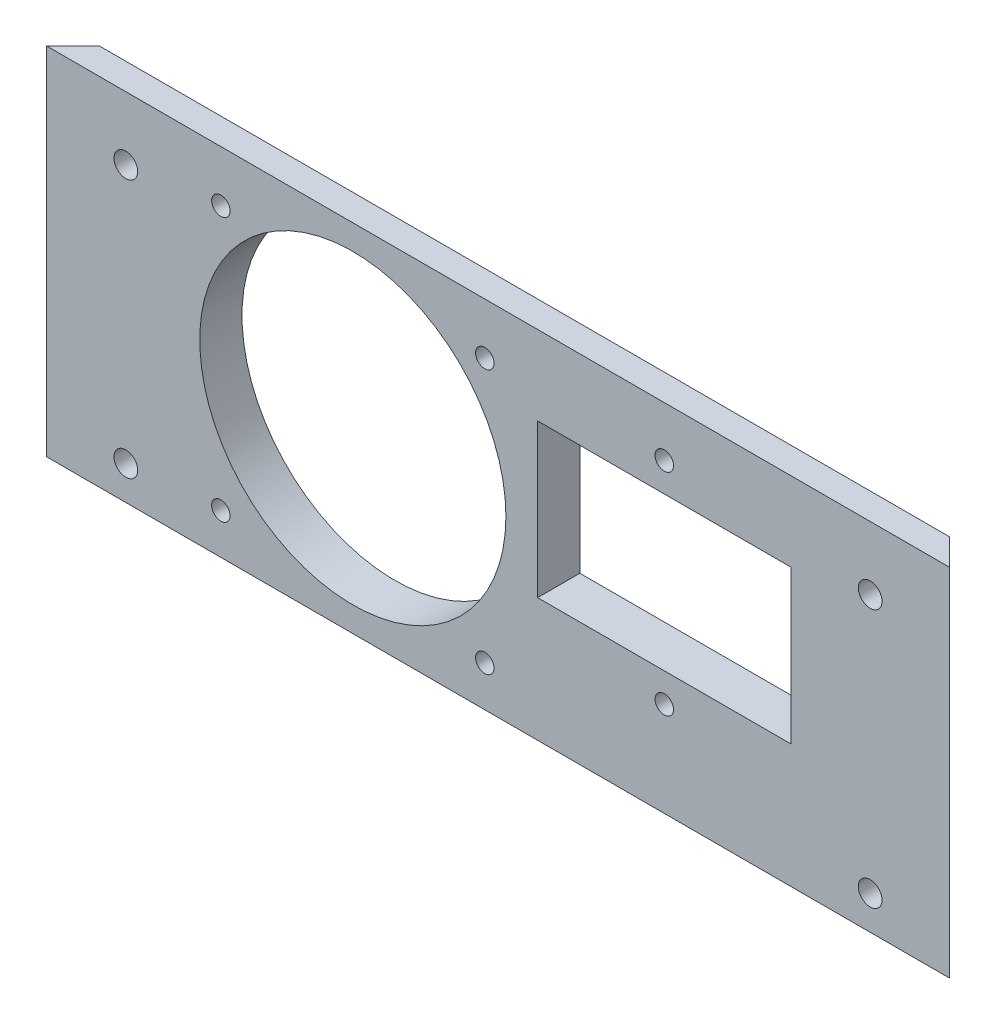
ISO-10303-21;
HEADER;
FILE_DESCRIPTION(('STEP AP214'),'2;1');
FILE_NAME('part.step','',(''),(''),'','','');
FILE_SCHEMA(('AUTOMOTIVE_DESIGN { 1 0 10303 214 1 1 1 1 }'));
ENDSEC;
DATA;
#1=APPLICATION_CONTEXT('core data for automotive mechanical design processes');
#2=APPLICATION_PROTOCOL_DEFINITION('international standard','automotive_design',2000,#1);
#3=PRODUCT_CONTEXT('',#1,'mechanical');
#4=PRODUCT('Part','Part','',(#3));
#5=PRODUCT_RELATED_PRODUCT_CATEGORY('part','',(#4));
#6=PRODUCT_DEFINITION_FORMATION('','',#4);
#7=PRODUCT_DEFINITION_CONTEXT('part definition',#1,'design');
#8=PRODUCT_DEFINITION('design','',#6,#7);
#9=PRODUCT_DEFINITION_SHAPE('','',#8);
#10=(LENGTH_UNIT() NAMED_UNIT(*) SI_UNIT(.MILLI.,.METRE.));
#11=(NAMED_UNIT(*) PLANE_ANGLE_UNIT() SI_UNIT($,.RADIAN.));
#12=(NAMED_UNIT(*) SI_UNIT($,.STERADIAN.) SOLID_ANGLE_UNIT());
#13=UNCERTAINTY_MEASURE_WITH_UNIT(LENGTH_MEASURE(1.E-05),#10,'distance_accuracy_value','');
#14=(GEOMETRIC_REPRESENTATION_CONTEXT(3) GLOBAL_UNCERTAINTY_ASSIGNED_CONTEXT((#13)) GLOBAL_UNIT_ASSIGNED_CONTEXT((#10,
#11,#12)) REPRESENTATION_CONTEXT('',''));
#15=CARTESIAN_POINT('',(0.,0.,0.));
#16=DIRECTION('',(0.,0.,1.));
#17=DIRECTION('',(1.,0.,0.));
#18=AXIS2_PLACEMENT_3D('',#15,#16,#17);
#19=CARTESIAN_POINT('',(0.,70.,-5.));
#20=DIRECTION('',(0.,1.,0.));
#21=DIRECTION('',(0.,0.,1.));
#22=AXIS2_PLACEMENT_3D('',#19,#20,#21);
#23=PLANE('',#22);
#24=DIRECTION('',(-0.707106781186546,0.,-0.707106781186549));
#25=VECTOR('',#24,1.);
#26=CARTESIAN_POINT('',(83.0000000000003,70.,-88.));
#27=LINE('',#26,#25);
#28=CARTESIAN_POINT('',(171.,70.,0.));
#29=VERTEX_POINT('',#28);
#30=CARTESIAN_POINT('',(166.,70.,-4.99999999999999));
#31=VERTEX_POINT('',#30);
#32=EDGE_CURVE('E222',#29,#31,#27,.T.);
#33=ORIENTED_EDGE('',*,*,#32,.T.);
#34=DIRECTION('',(-1.,0.,0.));
#35=VECTOR('',#34,1.);
#36=CARTESIAN_POINT('',(8.00000000000001,70.,-5.));
#37=LINE('',#36,#35);
#38=CARTESIAN_POINT('',(5.00000000000002,70.,-5.));
#39=VERTEX_POINT('',#38);
#40=EDGE_CURVE('E230',#31,#39,#37,.T.);
#41=ORIENTED_EDGE('',*,*,#40,.T.);
#42=DIRECTION('',(-0.707106781186546,0.,0.707106781186549));
#43=VECTOR('',#42,1.);
#44=CARTESIAN_POINT('',(2.50000000000002,70.,-2.49999999999999));
#45=LINE('',#44,#43);
#46=CARTESIAN_POINT('',(0.,70.,0.));
#47=VERTEX_POINT('',#46);
#48=EDGE_CURVE('E220',#39,#47,#45,.T.);
#49=ORIENTED_EDGE('',*,*,#48,.T.);
#50=DIRECTION('',(-1.,0.,0.));
#51=VECTOR('',#50,1.);
#52=CARTESIAN_POINT('',(0.,70.,0.));
#53=LINE('',#52,#51);
#54=EDGE_CURVE('E203',#29,#47,#53,.T.);
#55=ORIENTED_EDGE('',*,*,#54,.F.);
#56=EDGE_LOOP('',(#33,#41,#49,#55));
#57=FACE_BOUND('',#56,.T.);
#58=ADVANCED_FACE('F38',(#57),#23,.T.);
#59=CARTESIAN_POINT('',(0.,0.,-5.));
#60=DIRECTION('',(0.,0.,-1.));
#61=DIRECTION('',(-1.,0.,0.));
#62=AXIS2_PLACEMENT_3D('',#59,#60,#61);
#63=PLANE('',#62);
#64=DIRECTION('',(1.,0.,0.));
#65=VECTOR('',#64,1.);
#66=CARTESIAN_POINT('',(-5.,2.59999999999997,-4.99999999999988));
#67=LINE('',#66,#65);
#68=CARTESIAN_POINT('',(4.9999999999999,2.59999999999997,-4.99999999999988));
#69=VERTEX_POINT('',#68);
#70=CARTESIAN_POINT('',(166.,2.59999999999997,-4.99999999999988));
#71=VERTEX_POINT('',#70);
#72=EDGE_CURVE('E163',#69,#71,#67,.T.);
#73=ORIENTED_EDGE('',*,*,#72,.F.);
#74=DIRECTION('',(0.,1.,0.));
#75=VECTOR('',#74,1.);
#76=CARTESIAN_POINT('',(5.00000000000002,0.,-5.));
#77=LINE('',#76,#75);
#78=CARTESIAN_POINT('',(5.00000000000002,5.,-5.));
#79=VERTEX_POINT('',#78);
#80=EDGE_CURVE('E215',#69,#79,#77,.T.);
#81=ORIENTED_EDGE('',*,*,#80,.T.);
#82=DIRECTION('',(-1.,0.,0.));
#83=VECTOR('',#82,1.);
#84=CARTESIAN_POINT('',(0.,5.,-5.));
#85=LINE('',#84,#83);
#86=CARTESIAN_POINT('',(166.,4.99999999999997,-5.));
#87=VERTEX_POINT('',#86);
#88=EDGE_CURVE('E180',#87,#79,#85,.T.);
#89=ORIENTED_EDGE('',*,*,#88,.F.);
#90=DIRECTION('',(0.,-1.,0.));
#91=VECTOR('',#90,1.);
#92=CARTESIAN_POINT('',(166.,0.,-5.));
#93=LINE('',#92,#91);
#94=EDGE_CURVE('E217',#87,#71,#93,.T.);
#95=ORIENTED_EDGE('',*,*,#94,.T.);
#96=EDGE_LOOP('',(#73,#81,#89,#95));
#97=FACE_BOUND('',#96,.T.);
#98=ADVANCED_FACE('F260',(#97),#63,.T.);
#99=CARTESIAN_POINT('',(0.,0.,0.));
#100=DIRECTION('',(0.,0.,-1.));
#101=DIRECTION('',(-1.,0.,0.));
#102=AXIS2_PLACEMENT_3D('',#99,#100,#101);
#103=PLANE('',#102);
#104=CARTESIAN_POINT('',(83.0000000000004,10.3,0.));
#105=DIRECTION('',(0.,0.,1.));
#106=DIRECTION('',(1.,0.,0.));
#107=AXIS2_PLACEMENT_3D('',#104,#105,#106);
#108=CIRCLE('',#107,1.75);
#109=CARTESIAN_POINT('',(84.7500000000004,10.3,0.));
#110=VERTEX_POINT('',#109);
#111=EDGE_CURVE('E355',#110,#110,#108,.T.);
#112=ORIENTED_EDGE('',*,*,#111,.F.);
#113=EDGE_LOOP('',(#112));
#114=FACE_BOUND('',#113,.T.);
#115=CARTESIAN_POINT('',(82.9999999999999,60.3,0.));
#116=DIRECTION('',(0.,0.,1.));
#117=DIRECTION('',(1.,0.,0.));
#118=AXIS2_PLACEMENT_3D('',#115,#116,#117);
#119=CIRCLE('',#118,1.75);
#120=CARTESIAN_POINT('',(84.7499999999999,60.3,0.));
#121=VERTEX_POINT('',#120);
#122=EDGE_CURVE('E368',#121,#121,#119,.T.);
#123=ORIENTED_EDGE('',*,*,#122,.F.);
#124=EDGE_LOOP('',(#123));
#125=FACE_BOUND('',#124,.T.);
#126=CARTESIAN_POINT('',(57.9999999999999,36.3,0.));
#127=DIRECTION('',(0.,0.,1.));
#128=DIRECTION('',(1.,0.,0.));
#129=AXIS2_PLACEMENT_3D('',#126,#127,#128);
#130=CIRCLE('',#129,29.);
#131=CARTESIAN_POINT('',(86.9999999999999,36.3,0.));
#132=VERTEX_POINT('',#131);
#133=EDGE_CURVE('E145',#132,#132,#130,.T.);
#134=ORIENTED_EDGE('',*,*,#133,.F.);
#135=EDGE_LOOP('',(#134));
#136=FACE_BOUND('',#135,.T.);
#137=CARTESIAN_POINT('',(32.9999999999999,60.3,0.));
#138=DIRECTION('',(0.,0.,1.));
#139=DIRECTION('',(1.,0.,0.));
#140=AXIS2_PLACEMENT_3D('',#137,#138,#139);
#141=CIRCLE('',#140,1.75);
#142=CARTESIAN_POINT('',(34.7499999999999,60.3,0.));
#143=VERTEX_POINT('',#142);
#144=EDGE_CURVE('E367',#143,#143,#141,.T.);
#145=ORIENTED_EDGE('',*,*,#144,.F.);
#146=EDGE_LOOP('',(#145));
#147=FACE_BOUND('',#146,.T.);
#148=CARTESIAN_POINT('',(117.,20.5,0.));
#149=DIRECTION('',(0.,0.,1.));
#150=DIRECTION('',(1.,0.,0.));
#151=AXIS2_PLACEMENT_3D('',#148,#149,#150);
#152=CIRCLE('',#151,1.75000000000001);
#153=CARTESIAN_POINT('',(118.75,20.5,0.));
#154=VERTEX_POINT('',#153);
#155=EDGE_CURVE('E346',#154,#154,#152,.T.);
#156=ORIENTED_EDGE('',*,*,#155,.F.);
#157=EDGE_LOOP('',(#156));
#158=FACE_BOUND('',#157,.T.);
#159=CARTESIAN_POINT('',(117.,60.5,0.));
#160=DIRECTION('',(0.,0.,1.));
#161=DIRECTION('',(1.,0.,0.));
#162=AXIS2_PLACEMENT_3D('',#159,#160,#161);
#163=CIRCLE('',#162,1.75);
#164=CARTESIAN_POINT('',(118.75,60.5,0.));
#165=VERTEX_POINT('',#164);
#166=EDGE_CURVE('E349',#165,#165,#163,.T.);
#167=ORIENTED_EDGE('',*,*,#166,.F.);
#168=EDGE_LOOP('',(#167));
#169=FACE_BOUND('',#168,.T.);
#170=CARTESIAN_POINT('',(33.0000000000004,10.3,0.));
#171=DIRECTION('',(0.,0.,1.));
#172=DIRECTION('',(1.,0.,0.));
#173=AXIS2_PLACEMENT_3D('',#170,#171,#172);
#174=CIRCLE('',#173,1.75);
#175=CARTESIAN_POINT('',(34.7500000000004,10.3,0.));
#176=VERTEX_POINT('',#175);
#177=EDGE_CURVE('E356',#176,#176,#174,.T.);
#178=ORIENTED_EDGE('',*,*,#177,.F.);
#179=EDGE_LOOP('',(#178));
#180=FACE_BOUND('',#179,.T.);
#181=DIRECTION('',(1.,0.,0.));
#182=VECTOR('',#181,1.);
#183=CARTESIAN_POINT('',(92.9999999999999,26.,0.));
#184=LINE('',#183,#182);
#185=CARTESIAN_POINT('',(92.9999999999999,26.,0.));
#186=VERTEX_POINT('',#185);
#187=CARTESIAN_POINT('',(141.,26.,0.));
#188=VERTEX_POINT('',#187);
#189=EDGE_CURVE('E151',#186,#188,#184,.T.);
#190=ORIENTED_EDGE('',*,*,#189,.F.);
#191=DIRECTION('',(0.,-1.,0.));
#192=VECTOR('',#191,1.);
#193=CARTESIAN_POINT('',(92.9999999999999,26.,0.));
#194=LINE('',#193,#192);
#195=CARTESIAN_POINT('',(92.9999999999999,55.,0.));
#196=VERTEX_POINT('',#195);
#197=EDGE_CURVE('E54',#196,#186,#194,.T.);
#198=ORIENTED_EDGE('',*,*,#197,.F.);
#199=DIRECTION('',(-1.,0.,0.));
#200=VECTOR('',#199,1.);
#201=CARTESIAN_POINT('',(92.9999999999999,55.,0.));
#202=LINE('',#201,#200);
#203=CARTESIAN_POINT('',(141.,55.,0.));
#204=VERTEX_POINT('',#203);
#205=EDGE_CURVE('E139',#204,#196,#202,.T.);
#206=ORIENTED_EDGE('',*,*,#205,.F.);
#207=DIRECTION('',(0.,1.,0.));
#208=VECTOR('',#207,1.);
#209=CARTESIAN_POINT('',(141.,26.,0.));
#210=LINE('',#209,#208);
#211=EDGE_CURVE('E142',#188,#204,#210,.T.);
#212=ORIENTED_EDGE('',*,*,#211,.F.);
#213=EDGE_LOOP('',(#190,#198,#206,#212));
#214=FACE_BOUND('',#213,.T.);
#215=CARTESIAN_POINT('',(156.,58.,0.));
#216=DIRECTION('',(0.,0.,1.));
#217=DIRECTION('',(-1.,0.,0.));
#218=AXIS2_PLACEMENT_3D('',#215,#216,#217);
#219=CIRCLE('',#218,2.25000000000004);
#220=CARTESIAN_POINT('',(153.75,58.,0.));
#221=VERTEX_POINT('',#220);
#222=EDGE_CURVE('E184',#221,#221,#219,.T.);
#223=ORIENTED_EDGE('',*,*,#222,.F.);
#224=EDGE_LOOP('',(#223));
#225=FACE_BOUND('',#224,.T.);
#226=CARTESIAN_POINT('',(15.,58.,0.));
#227=DIRECTION('',(0.,0.,1.));
#228=DIRECTION('',(1.,0.,0.));
#229=AXIS2_PLACEMENT_3D('',#226,#227,#228);
#230=CIRCLE('',#229,2.25);
#231=CARTESIAN_POINT('',(17.25,58.,0.));
#232=VERTEX_POINT('',#231);
#233=EDGE_CURVE('E189',#232,#232,#230,.T.);
#234=ORIENTED_EDGE('',*,*,#233,.F.);
#235=EDGE_LOOP('',(#234));
#236=FACE_BOUND('',#235,.T.);
#237=CARTESIAN_POINT('',(156.,9.,0.));
#238=DIRECTION('',(0.,0.,1.));
#239=DIRECTION('',(-1.,0.,0.));
#240=AXIS2_PLACEMENT_3D('',#237,#238,#239);
#241=CIRCLE('',#240,2.25000000000004);
#242=CARTESIAN_POINT('',(153.75,9.,0.));
#243=VERTEX_POINT('',#242);
#244=EDGE_CURVE('E192',#243,#243,#241,.T.);
#245=ORIENTED_EDGE('',*,*,#244,.F.);
#246=EDGE_LOOP('',(#245));
#247=FACE_BOUND('',#246,.T.);
#248=CARTESIAN_POINT('',(15.,9.,0.));
#249=DIRECTION('',(0.,0.,1.));
#250=DIRECTION('',(1.,0.,0.));
#251=AXIS2_PLACEMENT_3D('',#248,#249,#250);
#252=CIRCLE('',#251,2.25);
#253=CARTESIAN_POINT('',(17.25,9.,0.));
#254=VERTEX_POINT('',#253);
#255=EDGE_CURVE('E195',#254,#254,#252,.T.);
#256=ORIENTED_EDGE('',*,*,#255,.F.);
#257=EDGE_LOOP('',(#256));
#258=FACE_BOUND('',#257,.T.);
#259=DIRECTION('',(0.,-1.,0.));
#260=VECTOR('',#259,1.);
#261=CARTESIAN_POINT('',(0.,0.,0.));
#262=LINE('',#261,#260);
#263=CARTESIAN_POINT('',(0.,2.59999999999997,0.));
#264=VERTEX_POINT('',#263);
#265=EDGE_CURVE('E198',#47,#264,#262,.T.);
#266=ORIENTED_EDGE('',*,*,#265,.T.);
#267=DIRECTION('',(1.,0.,0.));
#268=VECTOR('',#267,1.);
#269=CARTESIAN_POINT('',(0.,2.59999999999997,1.38777878078145E-13));
#270=LINE('',#269,#268);
#271=CARTESIAN_POINT('',(171.,2.59999999999997,1.38777878078145E-13));
#272=VERTEX_POINT('',#271);
#273=EDGE_CURVE('E164',#264,#272,#270,.T.);
#274=ORIENTED_EDGE('',*,*,#273,.T.);
#275=DIRECTION('',(0.,1.,0.));
#276=VECTOR('',#275,1.);
#277=CARTESIAN_POINT('',(171.,0.,0.));
#278=LINE('',#277,#276);
#279=EDGE_CURVE('E201',#272,#29,#278,.T.);
#280=ORIENTED_EDGE('',*,*,#279,.T.);
#281=ORIENTED_EDGE('',*,*,#54,.T.);
#282=EDGE_LOOP('',(#266,#274,#280,#281));
#283=FACE_BOUND('',#282,.T.);
#284=ADVANCED_FACE('F254',(#114,#125,#136,#147,#158,#169,#180,#214,#225,#236,#247,#258,#283),
#103,.F.);
#285=CARTESIAN_POINT('',(15.,9.,-5.));
#286=DIRECTION('',(0.,0.,1.));
#287=DIRECTION('',(1.,0.,0.));
#288=AXIS2_PLACEMENT_3D('',#285,#286,#287);
#289=CYLINDRICAL_SURFACE('',#288,2.25);
#290=ORIENTED_EDGE('',*,*,#255,.T.);
#291=EDGE_LOOP('',(#290));
#292=FACE_BOUND('',#291,.T.);
#293=CARTESIAN_POINT('',(15.,9.,-8.));
#294=DIRECTION('',(0.,0.,-1.));
#295=DIRECTION('',(-1.,0.,0.));
#296=AXIS2_PLACEMENT_3D('',#293,#294,#295);
#297=CIRCLE('',#296,2.25);
#298=CARTESIAN_POINT('',(12.75,9.,-8.));
#299=VERTEX_POINT('',#298);
#300=EDGE_CURVE('E174',#299,#299,#297,.T.);
#301=ORIENTED_EDGE('',*,*,#300,.T.);
#302=EDGE_LOOP('',(#301));
#303=FACE_BOUND('',#302,.T.);
#304=ADVANCED_FACE('F389',(#292,#303),#289,.F.);
#305=CARTESIAN_POINT('',(156.,9.,-5.));
#306=DIRECTION('',(0.,0.,1.));
#307=DIRECTION('',(1.,0.,0.));
#308=AXIS2_PLACEMENT_3D('',#305,#306,#307);
#309=CYLINDRICAL_SURFACE('',#308,2.25000000000004);
#310=ORIENTED_EDGE('',*,*,#244,.T.);
#311=EDGE_LOOP('',(#310));
#312=FACE_BOUND('',#311,.T.);
#313=CARTESIAN_POINT('',(156.,9.,-8.));
#314=DIRECTION('',(0.,0.,-1.));
#315=DIRECTION('',(-1.,0.,0.));
#316=AXIS2_PLACEMENT_3D('',#313,#314,#315);
#317=CIRCLE('',#316,2.25000000000004);
#318=CARTESIAN_POINT('',(153.75,9.,-8.));
#319=VERTEX_POINT('',#318);
#320=EDGE_CURVE('E171',#319,#319,#317,.T.);
#321=ORIENTED_EDGE('',*,*,#320,.T.);
#322=EDGE_LOOP('',(#321));
#323=FACE_BOUND('',#322,.T.);
#324=ADVANCED_FACE('F409',(#312,#323),#309,.F.);
#325=CARTESIAN_POINT('',(15.,58.,-5.));
#326=DIRECTION('',(0.,0.,1.));
#327=DIRECTION('',(1.,0.,0.));
#328=AXIS2_PLACEMENT_3D('',#325,#326,#327);
#329=CYLINDRICAL_SURFACE('',#328,2.25);
#330=ORIENTED_EDGE('',*,*,#233,.T.);
#331=EDGE_LOOP('',(#330));
#332=FACE_BOUND('',#331,.T.);
#333=CARTESIAN_POINT('',(15.,58.,-8.));
#334=DIRECTION('',(0.,0.,-1.));
#335=DIRECTION('',(-1.,0.,0.));
#336=AXIS2_PLACEMENT_3D('',#333,#334,#335);
#337=CIRCLE('',#336,2.25000000000001);
#338=CARTESIAN_POINT('',(12.75,58.,-8.));
#339=VERTEX_POINT('',#338);
#340=EDGE_CURVE('E177',#339,#339,#337,.T.);
#341=ORIENTED_EDGE('',*,*,#340,.T.);
#342=EDGE_LOOP('',(#341));
#343=FACE_BOUND('',#342,.T.);
#344=ADVANCED_FACE('F419',(#332,#343),#329,.F.);
#345=CARTESIAN_POINT('',(156.,58.,-5.));
#346=DIRECTION('',(0.,0.,1.));
#347=DIRECTION('',(1.,0.,0.));
#348=AXIS2_PLACEMENT_3D('',#345,#346,#347);
#349=CYLINDRICAL_SURFACE('',#348,2.25000000000004);
#350=ORIENTED_EDGE('',*,*,#222,.T.);
#351=EDGE_LOOP('',(#350));
#352=FACE_BOUND('',#351,.T.);
#353=CARTESIAN_POINT('',(156.,58.,-8.));
#354=DIRECTION('',(0.,0.,-1.));
#355=DIRECTION('',(-1.,0.,0.));
#356=AXIS2_PLACEMENT_3D('',#353,#354,#355);
#357=CIRCLE('',#356,2.25000000000004);
#358=CARTESIAN_POINT('',(153.75,58.,-8.));
#359=VERTEX_POINT('',#358);
#360=EDGE_CURVE('E167',#359,#359,#357,.T.);
#361=ORIENTED_EDGE('',*,*,#360,.T.);
#362=EDGE_LOOP('',(#361));
#363=FACE_BOUND('',#362,.T.);
#364=ADVANCED_FACE('F272',(#352,#363),#349,.F.);
#365=CARTESIAN_POINT('',(0.,0.,-8.));
#366=DIRECTION('',(0.,0.,1.));
#367=DIRECTION('',(1.,0.,0.));
#368=AXIS2_PLACEMENT_3D('',#365,#366,#367);
#369=PLANE('',#368);
#370=CARTESIAN_POINT('',(83.0000000000004,10.3,-8.));
#371=DIRECTION('',(0.,0.,1.));
#372=DIRECTION('',(1.,0.,0.));
#373=AXIS2_PLACEMENT_3D('',#370,#371,#372);
#374=CIRCLE('',#373,1.75);
#375=CARTESIAN_POINT('',(84.7500000000004,10.3,-8.));
#376=VERTEX_POINT('',#375);
#377=EDGE_CURVE('E371',#376,#376,#374,.T.);
#378=ORIENTED_EDGE('',*,*,#377,.T.);
#379=EDGE_LOOP('',(#378));
#380=FACE_BOUND('',#379,.T.);
#381=CARTESIAN_POINT('',(82.9999999999999,60.3,-8.));
#382=DIRECTION('',(0.,0.,1.));
#383=DIRECTION('',(1.,0.,0.));
#384=AXIS2_PLACEMENT_3D('',#381,#382,#383);
#385=CIRCLE('',#384,1.75);
#386=CARTESIAN_POINT('',(84.7499999999999,60.3,-8.));
#387=VERTEX_POINT('',#386);
#388=EDGE_CURVE('E364',#387,#387,#385,.T.);
#389=ORIENTED_EDGE('',*,*,#388,.T.);
#390=EDGE_LOOP('',(#389));
#391=FACE_BOUND('',#390,.T.);
#392=CARTESIAN_POINT('',(57.9999999999999,36.3,-8.));
#393=DIRECTION('',(0.,0.,1.));
#394=DIRECTION('',(1.,0.,0.));
#395=AXIS2_PLACEMENT_3D('',#392,#393,#394);
#396=CIRCLE('',#395,29.);
#397=CARTESIAN_POINT('',(86.9999999999999,36.3,-8.));
#398=VERTEX_POINT('',#397);
#399=EDGE_CURVE('E152',#398,#398,#396,.T.);
#400=ORIENTED_EDGE('',*,*,#399,.T.);
#401=EDGE_LOOP('',(#400));
#402=FACE_BOUND('',#401,.T.);
#403=CARTESIAN_POINT('',(32.9999999999999,60.3,-8.));
#404=DIRECTION('',(0.,0.,1.));
#405=DIRECTION('',(1.,0.,0.));
#406=AXIS2_PLACEMENT_3D('',#403,#404,#405);
#407=CIRCLE('',#406,1.75);
#408=CARTESIAN_POINT('',(34.7499999999999,60.3,-8.));
#409=VERTEX_POINT('',#408);
#410=EDGE_CURVE('E376',#409,#409,#407,.T.);
#411=ORIENTED_EDGE('',*,*,#410,.T.);
#412=EDGE_LOOP('',(#411));
#413=FACE_BOUND('',#412,.T.);
#414=CARTESIAN_POINT('',(117.,20.5,-8.));
#415=DIRECTION('',(0.,0.,1.));
#416=DIRECTION('',(1.,0.,0.));
#417=AXIS2_PLACEMENT_3D('',#414,#415,#416);
#418=CIRCLE('',#417,1.75000000000001);
#419=CARTESIAN_POINT('',(118.75,20.5,-8.));
#420=VERTEX_POINT('',#419);
#421=EDGE_CURVE('E343',#420,#420,#418,.T.);
#422=ORIENTED_EDGE('',*,*,#421,.T.);
#423=EDGE_LOOP('',(#422));
#424=FACE_BOUND('',#423,.T.);
#425=CARTESIAN_POINT('',(117.,60.5,-8.));
#426=DIRECTION('',(0.,0.,1.));
#427=DIRECTION('',(1.,0.,0.));
#428=AXIS2_PLACEMENT_3D('',#425,#426,#427);
#429=CIRCLE('',#428,1.75);
#430=CARTESIAN_POINT('',(118.75,60.5,-8.));
#431=VERTEX_POINT('',#430);
#432=EDGE_CURVE('E359',#431,#431,#429,.T.);
#433=ORIENTED_EDGE('',*,*,#432,.T.);
#434=EDGE_LOOP('',(#433));
#435=FACE_BOUND('',#434,.T.);
#436=CARTESIAN_POINT('',(33.0000000000004,10.3,-8.));
#437=DIRECTION('',(0.,0.,1.));
#438=DIRECTION('',(1.,0.,0.));
#439=AXIS2_PLACEMENT_3D('',#436,#437,#438);
#440=CIRCLE('',#439,1.75);
#441=CARTESIAN_POINT('',(34.7500000000004,10.3,-8.));
#442=VERTEX_POINT('',#441);
#443=EDGE_CURVE('E352',#442,#442,#440,.T.);
#444=ORIENTED_EDGE('',*,*,#443,.T.);
#445=EDGE_LOOP('',(#444));
#446=FACE_BOUND('',#445,.T.);
#447=DIRECTION('',(-1.,0.,0.));
#448=VECTOR('',#447,1.);
#449=CARTESIAN_POINT('',(92.9999999999999,55.,-8.));
#450=LINE('',#449,#448);
#451=CARTESIAN_POINT('',(141.,55.,-8.));
#452=VERTEX_POINT('',#451);
#453=CARTESIAN_POINT('',(92.9999999999999,55.,-8.));
#454=VERTEX_POINT('',#453);
#455=EDGE_CURVE('E129',#452,#454,#450,.T.);
#456=ORIENTED_EDGE('',*,*,#455,.T.);
#457=DIRECTION('',(0.,-1.,0.));
#458=VECTOR('',#457,1.);
#459=CARTESIAN_POINT('',(92.9999999999999,26.,-8.));
#460=LINE('',#459,#458);
#461=CARTESIAN_POINT('',(92.9999999999999,26.,-8.));
#462=VERTEX_POINT('',#461);
#463=EDGE_CURVE('E123',#454,#462,#460,.T.);
#464=ORIENTED_EDGE('',*,*,#463,.T.);
#465=DIRECTION('',(1.,0.,0.));
#466=VECTOR('',#465,1.);
#467=CARTESIAN_POINT('',(92.9999999999999,26.,-8.));
#468=LINE('',#467,#466);
#469=CARTESIAN_POINT('',(141.,26.,-8.));
#470=VERTEX_POINT('',#469);
#471=EDGE_CURVE('E132',#462,#470,#468,.T.);
#472=ORIENTED_EDGE('',*,*,#471,.T.);
#473=DIRECTION('',(0.,1.,0.));
#474=VECTOR('',#473,1.);
#475=CARTESIAN_POINT('',(141.,26.,-8.));
#476=LINE('',#475,#474);
#477=EDGE_CURVE('E62',#470,#452,#476,.T.);
#478=ORIENTED_EDGE('',*,*,#477,.T.);
#479=EDGE_LOOP('',(#456,#464,#472,#478));
#480=FACE_BOUND('',#479,.T.);
#481=DIRECTION('',(0.,1.,0.));
#482=VECTOR('',#481,1.);
#483=CARTESIAN_POINT('',(8.00000000000001,70.,-8.));
#484=LINE('',#483,#482);
#485=CARTESIAN_POINT('',(8.00000000000001,5.,-8.));
#486=VERTEX_POINT('',#485);
#487=CARTESIAN_POINT('',(8.00000000000001,67.,-8.));
#488=VERTEX_POINT('',#487);
#489=EDGE_CURVE('E206',#486,#488,#484,.T.);
#490=ORIENTED_EDGE('',*,*,#489,.T.);
#491=DIRECTION('',(1.,0.,0.));
#492=VECTOR('',#491,1.);
#493=CARTESIAN_POINT('',(163.,67.,-8.));
#494=LINE('',#493,#492);
#495=CARTESIAN_POINT('',(163.,67.,-8.));
#496=VERTEX_POINT('',#495);
#497=EDGE_CURVE('E225',#488,#496,#494,.T.);
#498=ORIENTED_EDGE('',*,*,#497,.T.);
#499=DIRECTION('',(0.,-1.,0.));
#500=VECTOR('',#499,1.);
#501=CARTESIAN_POINT('',(163.,4.99999999999997,-8.));
#502=LINE('',#501,#500);
#503=CARTESIAN_POINT('',(163.,4.99999999999997,-8.));
#504=VERTEX_POINT('',#503);
#505=EDGE_CURVE('E209',#496,#504,#502,.T.);
#506=ORIENTED_EDGE('',*,*,#505,.T.);
#507=DIRECTION('',(-1.,0.,0.));
#508=VECTOR('',#507,1.);
#509=CARTESIAN_POINT('',(0.,5.,-8.));
#510=LINE('',#509,#508);
#511=EDGE_CURVE('E181',#504,#486,#510,.T.);
#512=ORIENTED_EDGE('',*,*,#511,.T.);
#513=EDGE_LOOP('',(#490,#498,#506,#512));
#514=FACE_BOUND('',#513,.T.);
#515=ORIENTED_EDGE('',*,*,#340,.F.);
#516=EDGE_LOOP('',(#515));
#517=FACE_BOUND('',#516,.T.);
#518=ORIENTED_EDGE('',*,*,#300,.F.);
#519=EDGE_LOOP('',(#518));
#520=FACE_BOUND('',#519,.T.);
#521=ORIENTED_EDGE('',*,*,#320,.F.);
#522=EDGE_LOOP('',(#521));
#523=FACE_BOUND('',#522,.T.);
#524=ORIENTED_EDGE('',*,*,#360,.F.);
#525=EDGE_LOOP('',(#524));
#526=FACE_BOUND('',#525,.T.);
#527=ADVANCED_FACE('F136',(#380,#391,#402,#413,#424,#435,#446,#480,#514,#517,#520,#523,#526),
#369,.F.);
#528=CARTESIAN_POINT('',(0.,5.,-8.));
#529=DIRECTION('',(0.,1.,0.));
#530=DIRECTION('',(-1.,0.,0.));
#531=AXIS2_PLACEMENT_3D('',#528,#529,#530);
#532=PLANE('',#531);
#533=ORIENTED_EDGE('',*,*,#511,.F.);
#534=DIRECTION('',(0.707106781186546,0.,0.707106781186549));
#535=VECTOR('',#534,1.);
#536=CARTESIAN_POINT('',(163.,4.99999999999997,-8.));
#537=LINE('',#536,#535);
#538=EDGE_CURVE('E213',#504,#87,#537,.T.);
#539=ORIENTED_EDGE('',*,*,#538,.T.);
#540=ORIENTED_EDGE('',*,*,#88,.T.);
#541=DIRECTION('',(0.707106781186546,0.,-0.707106781186549));
#542=VECTOR('',#541,1.);
#543=CARTESIAN_POINT('',(8.00000000000001,5.,-8.));
#544=LINE('',#543,#542);
#545=EDGE_CURVE('E211',#79,#486,#544,.T.);
#546=ORIENTED_EDGE('',*,*,#545,.T.);
#547=EDGE_LOOP('',(#533,#539,#540,#546));
#548=FACE_BOUND('',#547,.T.);
#549=ADVANCED_FACE('F264',(#548),#532,.F.);
#550=CARTESIAN_POINT('',(163.,0.,-8.));
#551=DIRECTION('',(0.707106781186549,0.,-0.707106781186546));
#552=DIRECTION('',(0.,1.,0.));
#553=AXIS2_PLACEMENT_3D('',#550,#551,#552);
#554=PLANE('',#553);
#555=DIRECTION('',(0.707106781186547,0.,0.707106781186549));
#556=VECTOR('',#555,1.);
#557=CARTESIAN_POINT('',(171.,2.59999999999997,1.38777878078145E-13));
#558=LINE('',#557,#556);
#559=EDGE_CURVE('E158',#71,#272,#558,.T.);
#560=ORIENTED_EDGE('',*,*,#559,.F.);
#561=ORIENTED_EDGE('',*,*,#94,.F.);
#562=ORIENTED_EDGE('',*,*,#538,.F.);
#563=ORIENTED_EDGE('',*,*,#505,.F.);
#564=DIRECTION('',(0.577350269189624,0.577350269189627,0.577350269189626));
#565=VECTOR('',#564,1.);
#566=CARTESIAN_POINT('',(140.666666666667,44.6666666666666,-30.3333333333334));
#567=LINE('',#566,#565);
#568=EDGE_CURVE('E228',#496,#31,#567,.T.);
#569=ORIENTED_EDGE('',*,*,#568,.T.);
#570=ORIENTED_EDGE('',*,*,#32,.F.);
#571=ORIENTED_EDGE('',*,*,#279,.F.);
#572=EDGE_LOOP('',(#560,#561,#562,#563,#569,#570,#571));
#573=FACE_BOUND('',#572,.T.);
#574=ADVANCED_FACE('F248',(#573),#554,.T.);
#575=CARTESIAN_POINT('',(8.00000000000001,0.,-8.));
#576=DIRECTION('',(-0.707106781186549,0.,-0.707106781186546));
#577=DIRECTION('',(0.,-1.,0.));
#578=AXIS2_PLACEMENT_3D('',#575,#576,#577);
#579=PLANE('',#578);
#580=DIRECTION('',(0.707106781186546,0.,-0.707106781186549));
#581=VECTOR('',#580,1.);
#582=CARTESIAN_POINT('',(8.00000000000001,2.59999999999997,-8.));
#583=LINE('',#582,#581);
#584=EDGE_CURVE('E11',#264,#69,#583,.T.);
#585=ORIENTED_EDGE('',*,*,#584,.F.);
#586=ORIENTED_EDGE('',*,*,#265,.F.);
#587=ORIENTED_EDGE('',*,*,#48,.F.);
#588=DIRECTION('',(0.577350269189624,-0.577350269189627,-0.577350269189626));
#589=VECTOR('',#588,1.);
#590=CARTESIAN_POINT('',(30.3333333333333,44.6666666666666,-30.3333333333334));
#591=LINE('',#590,#589);
#592=EDGE_CURVE('E47',#39,#488,#591,.T.);
#593=ORIENTED_EDGE('',*,*,#592,.T.);
#594=ORIENTED_EDGE('',*,*,#489,.F.);
#595=ORIENTED_EDGE('',*,*,#545,.F.);
#596=ORIENTED_EDGE('',*,*,#80,.F.);
#597=EDGE_LOOP('',(#585,#586,#587,#593,#594,#595,#596));
#598=FACE_BOUND('',#597,.T.);
#599=ADVANCED_FACE('F236',(#598),#579,.T.);
#600=CARTESIAN_POINT('',(0.,67.,-8.));
#601=DIRECTION('',(0.,0.707106781186547,-0.707106781186548));
#602=DIRECTION('',(-1.,0.,0.));
#603=AXIS2_PLACEMENT_3D('',#600,#601,#602);
#604=PLANE('',#603);
#605=ORIENTED_EDGE('',*,*,#592,.F.);
#606=ORIENTED_EDGE('',*,*,#40,.F.);
#607=ORIENTED_EDGE('',*,*,#568,.F.);
#608=ORIENTED_EDGE('',*,*,#497,.F.);
#609=EDGE_LOOP('',(#605,#606,#607,#608));
#610=FACE_BOUND('',#609,.T.);
#611=ADVANCED_FACE('F41',(#610),#604,.T.);
#612=CARTESIAN_POINT('',(0.,2.59999999999997,1.38777878078145E-13));
#613=DIRECTION('',(0.,1.,0.));
#614=DIRECTION('',(-1.,0.,0.));
#615=AXIS2_PLACEMENT_3D('',#612,#613,#614);
#616=PLANE('',#615);
#617=ORIENTED_EDGE('',*,*,#584,.T.);
#618=ORIENTED_EDGE('',*,*,#72,.T.);
#619=ORIENTED_EDGE('',*,*,#559,.T.);
#620=ORIENTED_EDGE('',*,*,#273,.F.);
#621=EDGE_LOOP('',(#617,#618,#619,#620));
#622=FACE_BOUND('',#621,.T.);
#623=ADVANCED_FACE('F258',(#622),#616,.F.);
#624=CARTESIAN_POINT('',(92.9999999999999,26.,-8.));
#625=DIRECTION('',(-1.,0.,0.));
#626=DIRECTION('',(0.,0.,1.));
#627=AXIS2_PLACEMENT_3D('',#624,#625,#626);
#628=PLANE('',#627);
#629=ORIENTED_EDGE('',*,*,#197,.T.);
#630=DIRECTION('',(0.,0.,1.));
#631=VECTOR('',#630,1.);
#632=CARTESIAN_POINT('',(92.9999999999999,26.,-8.));
#633=LINE('',#632,#631);
#634=EDGE_CURVE('E119',#462,#186,#633,.T.);
#635=ORIENTED_EDGE('',*,*,#634,.F.);
#636=ORIENTED_EDGE('',*,*,#463,.F.);
#637=DIRECTION('',(0.,0.,1.));
#638=VECTOR('',#637,1.);
#639=CARTESIAN_POINT('',(92.9999999999999,55.,-8.));
#640=LINE('',#639,#638);
#641=EDGE_CURVE('E156',#454,#196,#640,.T.);
#642=ORIENTED_EDGE('',*,*,#641,.T.);
#643=EDGE_LOOP('',(#629,#635,#636,#642));
#644=FACE_BOUND('',#643,.T.);
#645=ADVANCED_FACE('F121',(#644),#628,.F.);
#646=CARTESIAN_POINT('',(92.9999999999999,55.,-8.));
#647=DIRECTION('',(0.,1.,0.));
#648=DIRECTION('',(-1.,0.,0.));
#649=AXIS2_PLACEMENT_3D('',#646,#647,#648);
#650=PLANE('',#649);
#651=ORIENTED_EDGE('',*,*,#205,.T.);
#652=ORIENTED_EDGE('',*,*,#641,.F.);
#653=ORIENTED_EDGE('',*,*,#455,.F.);
#654=DIRECTION('',(0.,0.,1.));
#655=VECTOR('',#654,1.);
#656=CARTESIAN_POINT('',(141.,55.,-8.));
#657=LINE('',#656,#655);
#658=EDGE_CURVE('E159',#452,#204,#657,.T.);
#659=ORIENTED_EDGE('',*,*,#658,.T.);
#660=EDGE_LOOP('',(#651,#652,#653,#659));
#661=FACE_BOUND('',#660,.T.);
#662=ADVANCED_FACE('F300',(#661),#650,.F.);
#663=CARTESIAN_POINT('',(141.,26.,-8.));
#664=DIRECTION('',(1.,0.,0.));
#665=DIRECTION('',(0.,0.,-1.));
#666=AXIS2_PLACEMENT_3D('',#663,#664,#665);
#667=PLANE('',#666);
#668=ORIENTED_EDGE('',*,*,#211,.T.);
#669=ORIENTED_EDGE('',*,*,#658,.F.);
#670=ORIENTED_EDGE('',*,*,#477,.F.);
#671=DIRECTION('',(0.,0.,1.));
#672=VECTOR('',#671,1.);
#673=CARTESIAN_POINT('',(141.,26.,-8.));
#674=LINE('',#673,#672);
#675=EDGE_CURVE('E128',#470,#188,#674,.T.);
#676=ORIENTED_EDGE('',*,*,#675,.T.);
#677=EDGE_LOOP('',(#668,#669,#670,#676));
#678=FACE_BOUND('',#677,.T.);
#679=ADVANCED_FACE('F306',(#678),#667,.F.);
#680=CARTESIAN_POINT('',(92.9999999999999,26.,-8.));
#681=DIRECTION('',(0.,-1.,0.));
#682=DIRECTION('',(1.,0.,0.));
#683=AXIS2_PLACEMENT_3D('',#680,#681,#682);
#684=PLANE('',#683);
#685=ORIENTED_EDGE('',*,*,#189,.T.);
#686=ORIENTED_EDGE('',*,*,#675,.F.);
#687=ORIENTED_EDGE('',*,*,#471,.F.);
#688=ORIENTED_EDGE('',*,*,#634,.T.);
#689=EDGE_LOOP('',(#685,#686,#687,#688));
#690=FACE_BOUND('',#689,.T.);
#691=ADVANCED_FACE('F133',(#690),#684,.F.);
#692=CARTESIAN_POINT('',(33.0000000000004,10.3,-8.));
#693=DIRECTION('',(0.,0.,1.));
#694=DIRECTION('',(1.,0.,0.));
#695=AXIS2_PLACEMENT_3D('',#692,#693,#694);
#696=CYLINDRICAL_SURFACE('',#695,1.75);
#697=ORIENTED_EDGE('',*,*,#443,.F.);
#698=EDGE_LOOP('',(#697));
#699=FACE_BOUND('',#698,.T.);
#700=ORIENTED_EDGE('',*,*,#177,.T.);
#701=EDGE_LOOP('',(#700));
#702=FACE_BOUND('',#701,.T.);
#703=ADVANCED_FACE('F305',(#699,#702),#696,.F.);
#704=CARTESIAN_POINT('',(117.,60.5,-8.));
#705=DIRECTION('',(0.,0.,1.));
#706=DIRECTION('',(1.,0.,0.));
#707=AXIS2_PLACEMENT_3D('',#704,#705,#706);
#708=CYLINDRICAL_SURFACE('',#707,1.75);
#709=ORIENTED_EDGE('',*,*,#432,.F.);
#710=EDGE_LOOP('',(#709));
#711=FACE_BOUND('',#710,.T.);
#712=ORIENTED_EDGE('',*,*,#166,.T.);
#713=EDGE_LOOP('',(#712));
#714=FACE_BOUND('',#713,.T.);
#715=ADVANCED_FACE('F329',(#711,#714),#708,.F.);
#716=CARTESIAN_POINT('',(117.,20.5,-8.));
#717=DIRECTION('',(0.,0.,1.));
#718=DIRECTION('',(1.,0.,0.));
#719=AXIS2_PLACEMENT_3D('',#716,#717,#718);
#720=CYLINDRICAL_SURFACE('',#719,1.75000000000001);
#721=ORIENTED_EDGE('',*,*,#421,.F.);
#722=EDGE_LOOP('',(#721));
#723=FACE_BOUND('',#722,.T.);
#724=ORIENTED_EDGE('',*,*,#155,.T.);
#725=EDGE_LOOP('',(#724));
#726=FACE_BOUND('',#725,.T.);
#727=ADVANCED_FACE('F320',(#723,#726),#720,.F.);
#728=CARTESIAN_POINT('',(32.9999999999999,60.3,-8.));
#729=DIRECTION('',(0.,0.,1.));
#730=DIRECTION('',(1.,0.,0.));
#731=AXIS2_PLACEMENT_3D('',#728,#729,#730);
#732=CYLINDRICAL_SURFACE('',#731,1.75);
#733=ORIENTED_EDGE('',*,*,#410,.F.);
#734=EDGE_LOOP('',(#733));
#735=FACE_BOUND('',#734,.T.);
#736=ORIENTED_EDGE('',*,*,#144,.T.);
#737=EDGE_LOOP('',(#736));
#738=FACE_BOUND('',#737,.T.);
#739=ADVANCED_FACE('F316',(#735,#738),#732,.F.);
#740=CARTESIAN_POINT('',(57.9999999999999,36.3,-8.));
#741=DIRECTION('',(0.,0.,1.));
#742=DIRECTION('',(1.,0.,0.));
#743=AXIS2_PLACEMENT_3D('',#740,#741,#742);
#744=CYLINDRICAL_SURFACE('',#743,29.);
#745=ORIENTED_EDGE('',*,*,#399,.F.);
#746=EDGE_LOOP('',(#745));
#747=FACE_BOUND('',#746,.T.);
#748=ORIENTED_EDGE('',*,*,#133,.T.);
#749=EDGE_LOOP('',(#748));
#750=FACE_BOUND('',#749,.T.);
#751=ADVANCED_FACE('F312',(#747,#750),#744,.F.);
#752=CARTESIAN_POINT('',(82.9999999999999,60.3,-8.));
#753=DIRECTION('',(0.,0.,1.));
#754=DIRECTION('',(1.,0.,0.));
#755=AXIS2_PLACEMENT_3D('',#752,#753,#754);
#756=CYLINDRICAL_SURFACE('',#755,1.75);
#757=ORIENTED_EDGE('',*,*,#388,.F.);
#758=EDGE_LOOP('',(#757));
#759=FACE_BOUND('',#758,.T.);
#760=ORIENTED_EDGE('',*,*,#122,.T.);
#761=EDGE_LOOP('',(#760));
#762=FACE_BOUND('',#761,.T.);
#763=ADVANCED_FACE('F315',(#759,#762),#756,.F.);
#764=CARTESIAN_POINT('',(83.0000000000004,10.3,-8.));
#765=DIRECTION('',(0.,0.,1.));
#766=DIRECTION('',(1.,0.,0.));
#767=AXIS2_PLACEMENT_3D('',#764,#765,#766);
#768=CYLINDRICAL_SURFACE('',#767,1.75);
#769=ORIENTED_EDGE('',*,*,#377,.F.);
#770=EDGE_LOOP('',(#769));
#771=FACE_BOUND('',#770,.T.);
#772=ORIENTED_EDGE('',*,*,#111,.T.);
#773=EDGE_LOOP('',(#772));
#774=FACE_BOUND('',#773,.T.);
#775=ADVANCED_FACE('F322',(#771,#774),#768,.F.);
#776=CLOSED_SHELL('',(#58,#98,#284,#304,#324,#344,#364,#527,#549,#574,#599,#611,#623,#645,#662,
#679,#691,#703,#715,#727,#739,#751,#763,#775));
#777=MANIFOLD_SOLID_BREP('B2',#776);
#778=ADVANCED_BREP_SHAPE_REPRESENTATION('',(#18,#777),#14);
#779=SHAPE_DEFINITION_REPRESENTATION(#9,#778);
ENDSEC;
END-ISO-10303-21;
